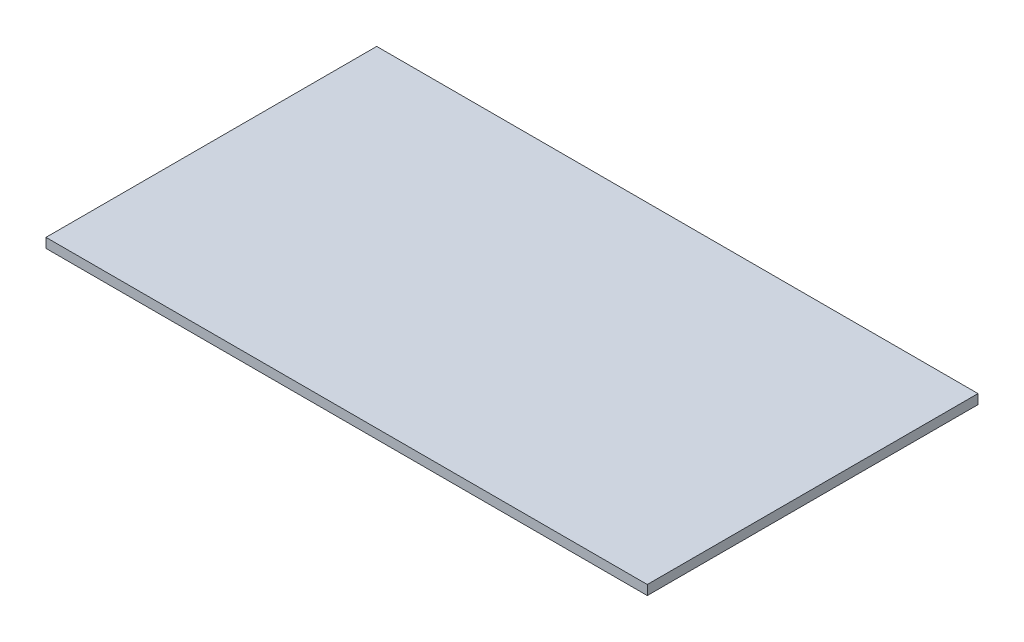
ISO-10303-21;
HEADER;
FILE_DESCRIPTION(('STEP AP214'),'2;1');
FILE_NAME('part.step','',(''),(''),'','','');
FILE_SCHEMA(('AUTOMOTIVE_DESIGN { 1 0 10303 214 1 1 1 1 }'));
ENDSEC;
DATA;
#1=APPLICATION_CONTEXT('core data for automotive mechanical design processes');
#2=APPLICATION_PROTOCOL_DEFINITION('international standard','automotive_design',2000,#1);
#3=PRODUCT_CONTEXT('',#1,'mechanical');
#4=PRODUCT('Part','Part','',(#3));
#5=PRODUCT_RELATED_PRODUCT_CATEGORY('part','',(#4));
#6=PRODUCT_DEFINITION_FORMATION('','',#4);
#7=PRODUCT_DEFINITION_CONTEXT('part definition',#1,'design');
#8=PRODUCT_DEFINITION('design','',#6,#7);
#9=PRODUCT_DEFINITION_SHAPE('','',#8);
#10=(LENGTH_UNIT() NAMED_UNIT(*) SI_UNIT(.MILLI.,.METRE.));
#11=(NAMED_UNIT(*) PLANE_ANGLE_UNIT() SI_UNIT($,.RADIAN.));
#12=(NAMED_UNIT(*) SI_UNIT($,.STERADIAN.) SOLID_ANGLE_UNIT());
#13=UNCERTAINTY_MEASURE_WITH_UNIT(LENGTH_MEASURE(1.E-05),#10,'distance_accuracy_value','');
#14=(GEOMETRIC_REPRESENTATION_CONTEXT(3) GLOBAL_UNCERTAINTY_ASSIGNED_CONTEXT((#13)) GLOBAL_UNIT_ASSIGNED_CONTEXT((#10,
#11,#12)) REPRESENTATION_CONTEXT('',''));
#15=CARTESIAN_POINT('',(0.,0.,0.));
#16=DIRECTION('',(0.,0.,1.));
#17=DIRECTION('',(1.,0.,0.));
#18=AXIS2_PLACEMENT_3D('',#15,#16,#17);
#19=CARTESIAN_POINT('',(-50.,1.6,27.5));
#20=DIRECTION('',(1.,0.,0.));
#21=DIRECTION('',(0.,0.,-1.));
#22=AXIS2_PLACEMENT_3D('',#19,#20,#21);
#23=PLANE('',#22);
#24=DIRECTION('',(0.,0.,1.));
#25=VECTOR('',#24,1.);
#26=CARTESIAN_POINT('',(-50.,0.,27.5));
#27=LINE('',#26,#25);
#28=CARTESIAN_POINT('',(-50.,0.,-27.5));
#29=VERTEX_POINT('',#28);
#30=CARTESIAN_POINT('',(-50.,0.,27.5));
#31=VERTEX_POINT('',#30);
#32=EDGE_CURVE('E105',#29,#31,#27,.T.);
#33=ORIENTED_EDGE('',*,*,#32,.T.);
#34=DIRECTION('',(0.,-1.,0.));
#35=VECTOR('',#34,1.);
#36=CARTESIAN_POINT('',(-50.,1.6,27.5));
#37=LINE('',#36,#35);
#38=CARTESIAN_POINT('',(-50.,1.6,27.5));
#39=VERTEX_POINT('',#38);
#40=EDGE_CURVE('E11',#39,#31,#37,.T.);
#41=ORIENTED_EDGE('',*,*,#40,.F.);
#42=DIRECTION('',(0.,0.,1.));
#43=VECTOR('',#42,1.);
#44=CARTESIAN_POINT('',(-50.,1.6,27.5));
#45=LINE('',#44,#43);
#46=CARTESIAN_POINT('',(-50.,1.6,-27.5));
#47=VERTEX_POINT('',#46);
#48=EDGE_CURVE('E89',#47,#39,#45,.T.);
#49=ORIENTED_EDGE('',*,*,#48,.F.);
#50=DIRECTION('',(0.,-1.,0.));
#51=VECTOR('',#50,1.);
#52=CARTESIAN_POINT('',(-50.,1.6,-27.5));
#53=LINE('',#52,#51);
#54=EDGE_CURVE('E97',#47,#29,#53,.T.);
#55=ORIENTED_EDGE('',*,*,#54,.T.);
#56=EDGE_LOOP('',(#33,#41,#49,#55));
#57=FACE_BOUND('',#56,.T.);
#58=ADVANCED_FACE('F39',(#57),#23,.F.);
#59=CARTESIAN_POINT('',(-50.,1.6,27.5));
#60=DIRECTION('',(0.,0.,-1.));
#61=DIRECTION('',(-1.,0.,0.));
#62=AXIS2_PLACEMENT_3D('',#59,#60,#61);
#63=PLANE('',#62);
#64=DIRECTION('',(1.,0.,0.));
#65=VECTOR('',#64,1.);
#66=CARTESIAN_POINT('',(-50.,0.,27.5));
#67=LINE('',#66,#65);
#68=CARTESIAN_POINT('',(50.,0.,27.5));
#69=VERTEX_POINT('',#68);
#70=EDGE_CURVE('E92',#31,#69,#67,.T.);
#71=ORIENTED_EDGE('',*,*,#70,.T.);
#72=DIRECTION('',(0.,-1.,0.));
#73=VECTOR('',#72,1.);
#74=CARTESIAN_POINT('',(50.,1.6,27.5));
#75=LINE('',#74,#73);
#76=CARTESIAN_POINT('',(50.,1.6,27.5));
#77=VERTEX_POINT('',#76);
#78=EDGE_CURVE('E50',#77,#69,#75,.T.);
#79=ORIENTED_EDGE('',*,*,#78,.F.);
#80=DIRECTION('',(1.,0.,0.));
#81=VECTOR('',#80,1.);
#82=CARTESIAN_POINT('',(-50.,1.6,27.5));
#83=LINE('',#82,#81);
#84=EDGE_CURVE('E82',#39,#77,#83,.T.);
#85=ORIENTED_EDGE('',*,*,#84,.F.);
#86=ORIENTED_EDGE('',*,*,#40,.T.);
#87=EDGE_LOOP('',(#71,#79,#85,#86));
#88=FACE_BOUND('',#87,.T.);
#89=ADVANCED_FACE('F93',(#88),#63,.F.);
#90=CARTESIAN_POINT('',(50.,1.6,27.5));
#91=DIRECTION('',(-1.,0.,0.));
#92=DIRECTION('',(0.,0.,1.));
#93=AXIS2_PLACEMENT_3D('',#90,#91,#92);
#94=PLANE('',#93);
#95=DIRECTION('',(0.,0.,-1.));
#96=VECTOR('',#95,1.);
#97=CARTESIAN_POINT('',(50.,0.,27.5));
#98=LINE('',#97,#96);
#99=CARTESIAN_POINT('',(50.,0.,-27.5));
#100=VERTEX_POINT('',#99);
#101=EDGE_CURVE('E72',#69,#100,#98,.T.);
#102=ORIENTED_EDGE('',*,*,#101,.T.);
#103=DIRECTION('',(0.,-1.,0.));
#104=VECTOR('',#103,1.);
#105=CARTESIAN_POINT('',(50.,1.6,-27.5));
#106=LINE('',#105,#104);
#107=CARTESIAN_POINT('',(50.,1.6,-27.5));
#108=VERTEX_POINT('',#107);
#109=EDGE_CURVE('E94',#108,#100,#106,.T.);
#110=ORIENTED_EDGE('',*,*,#109,.F.);
#111=DIRECTION('',(0.,0.,-1.));
#112=VECTOR('',#111,1.);
#113=CARTESIAN_POINT('',(50.,1.6,27.5));
#114=LINE('',#113,#112);
#115=EDGE_CURVE('E88',#77,#108,#114,.T.);
#116=ORIENTED_EDGE('',*,*,#115,.F.);
#117=ORIENTED_EDGE('',*,*,#78,.T.);
#118=EDGE_LOOP('',(#102,#110,#116,#117));
#119=FACE_BOUND('',#118,.T.);
#120=ADVANCED_FACE('F96',(#119),#94,.F.);
#121=CARTESIAN_POINT('',(-50.,1.6,-27.5));
#122=DIRECTION('',(0.,0.,1.));
#123=DIRECTION('',(1.,0.,0.));
#124=AXIS2_PLACEMENT_3D('',#121,#122,#123);
#125=PLANE('',#124);
#126=DIRECTION('',(-1.,0.,0.));
#127=VECTOR('',#126,1.);
#128=CARTESIAN_POINT('',(-50.,0.,-27.5));
#129=LINE('',#128,#127);
#130=EDGE_CURVE('E76',#100,#29,#129,.T.);
#131=ORIENTED_EDGE('',*,*,#130,.T.);
#132=ORIENTED_EDGE('',*,*,#54,.F.);
#133=DIRECTION('',(-1.,0.,0.));
#134=VECTOR('',#133,1.);
#135=CARTESIAN_POINT('',(-50.,1.6,-27.5));
#136=LINE('',#135,#134);
#137=EDGE_CURVE('E54',#108,#47,#136,.T.);
#138=ORIENTED_EDGE('',*,*,#137,.F.);
#139=ORIENTED_EDGE('',*,*,#109,.T.);
#140=EDGE_LOOP('',(#131,#132,#138,#139));
#141=FACE_BOUND('',#140,.T.);
#142=ADVANCED_FACE('F108',(#141),#125,.F.);
#143=CARTESIAN_POINT('',(0.,1.6,0.));
#144=DIRECTION('',(0.,-1.,0.));
#145=DIRECTION('',(0.,0.,-1.));
#146=AXIS2_PLACEMENT_3D('',#143,#144,#145);
#147=PLANE('',#146);
#148=ORIENTED_EDGE('',*,*,#48,.T.);
#149=ORIENTED_EDGE('',*,*,#84,.T.);
#150=ORIENTED_EDGE('',*,*,#115,.T.);
#151=ORIENTED_EDGE('',*,*,#137,.T.);
#152=EDGE_LOOP('',(#148,#149,#150,#151));
#153=FACE_BOUND('',#152,.T.);
#154=ADVANCED_FACE('F86',(#153),#147,.F.);
#155=CARTESIAN_POINT('',(0.,0.,0.));
#156=DIRECTION('',(0.,-1.,0.));
#157=DIRECTION('',(0.,0.,-1.));
#158=AXIS2_PLACEMENT_3D('',#155,#156,#157);
#159=PLANE('',#158);
#160=ORIENTED_EDGE('',*,*,#32,.F.);
#161=ORIENTED_EDGE('',*,*,#130,.F.);
#162=ORIENTED_EDGE('',*,*,#101,.F.);
#163=ORIENTED_EDGE('',*,*,#70,.F.);
#164=EDGE_LOOP('',(#160,#161,#162,#163));
#165=FACE_BOUND('',#164,.T.);
#166=ADVANCED_FACE('F115',(#165),#159,.T.);
#167=CLOSED_SHELL('',(#58,#89,#120,#142,#154,#166));
#168=MANIFOLD_SOLID_BREP('B2',#167);
#169=ADVANCED_BREP_SHAPE_REPRESENTATION('',(#18,#168),#14);
#170=SHAPE_DEFINITION_REPRESENTATION(#9,#169);
ENDSEC;
END-ISO-10303-21;
